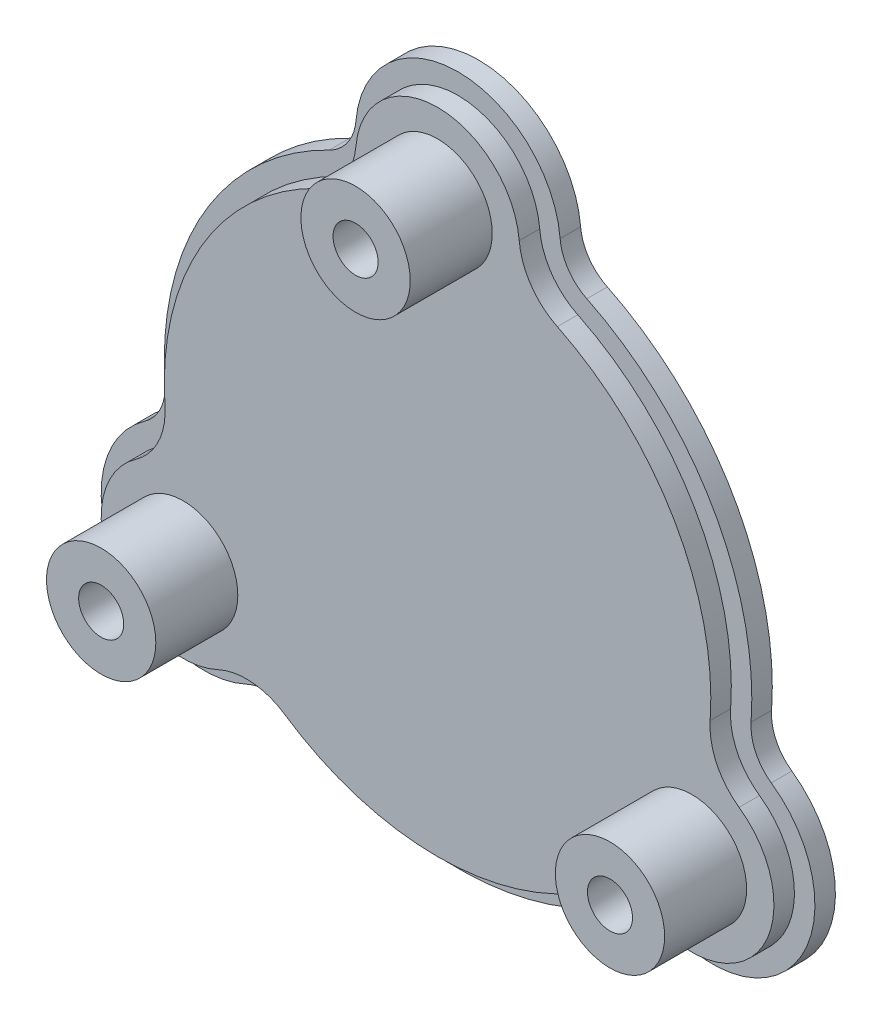
ISO-10303-21;
HEADER;
FILE_DESCRIPTION(('STEP AP214'),'2;1');
FILE_NAME('part.step','',(''),(''),'','','');
FILE_SCHEMA(('AUTOMOTIVE_DESIGN { 1 0 10303 214 1 1 1 1 }'));
ENDSEC;
DATA;
#1=APPLICATION_CONTEXT('core data for automotive mechanical design processes');
#2=APPLICATION_PROTOCOL_DEFINITION('international standard','automotive_design',2000,#1);
#3=PRODUCT_CONTEXT('',#1,'mechanical');
#4=PRODUCT('Part','Part','',(#3));
#5=PRODUCT_RELATED_PRODUCT_CATEGORY('part','',(#4));
#6=PRODUCT_DEFINITION_FORMATION('','',#4);
#7=PRODUCT_DEFINITION_CONTEXT('part definition',#1,'design');
#8=PRODUCT_DEFINITION('design','',#6,#7);
#9=PRODUCT_DEFINITION_SHAPE('','',#8);
#10=(LENGTH_UNIT() NAMED_UNIT(*) SI_UNIT(.MILLI.,.METRE.));
#11=(NAMED_UNIT(*) PLANE_ANGLE_UNIT() SI_UNIT($,.RADIAN.));
#12=(NAMED_UNIT(*) SI_UNIT($,.STERADIAN.) SOLID_ANGLE_UNIT());
#13=UNCERTAINTY_MEASURE_WITH_UNIT(LENGTH_MEASURE(1.E-05),#10,'distance_accuracy_value','');
#14=(GEOMETRIC_REPRESENTATION_CONTEXT(3) GLOBAL_UNCERTAINTY_ASSIGNED_CONTEXT((#13)) GLOBAL_UNIT_ASSIGNED_CONTEXT((#10,
#11,#12)) REPRESENTATION_CONTEXT('',''));
#15=CARTESIAN_POINT('',(0.,0.,0.));
#16=DIRECTION('',(0.,0.,1.));
#17=DIRECTION('',(1.,0.,0.));
#18=AXIS2_PLACEMENT_3D('',#15,#16,#17);
#19=CARTESIAN_POINT('',(49.8778588175734,-3.49273528544797,3.));
#20=DIRECTION('',(0.,0.,-1.));
#21=DIRECTION('',(-1.,0.,0.));
#22=AXIS2_PLACEMENT_3D('',#19,#20,#21);
#23=CYLINDRICAL_SURFACE('',#22,7.);
#24=CARTESIAN_POINT('',(49.8778588175734,-3.49273528544797,0.));
#25=DIRECTION('',(0.,0.,1.));
#26=DIRECTION('',(1.,0.,0.));
#27=AXIS2_PLACEMENT_3D('',#24,#25,#26);
#28=CIRCLE('',#27,7.);
#29=CARTESIAN_POINT('',(42.8949585831132,-3.00375234548526,0.));
#30=VERTEX_POINT('',#29);
#31=CARTESIAN_POINT('',(45.8564331273962,-9.22231951280553,0.));
#32=VERTEX_POINT('',#31);
#33=EDGE_CURVE('E243',#30,#32,#28,.T.);
#34=ORIENTED_EDGE('',*,*,#33,.F.);
#35=DIRECTION('',(0.,0.,-1.));
#36=VECTOR('',#35,1.);
#37=CARTESIAN_POINT('',(42.8949585831132,-3.00375234548526,3.));
#38=LINE('',#37,#36);
#39=CARTESIAN_POINT('',(42.8949585831132,-3.00375234548526,3.));
#40=VERTEX_POINT('',#39);
#41=EDGE_CURVE('E11',#40,#30,#38,.T.);
#42=ORIENTED_EDGE('',*,*,#41,.F.);
#43=CARTESIAN_POINT('',(49.8778588175734,-3.49273528544797,3.));
#44=DIRECTION('',(0.,0.,1.));
#45=DIRECTION('',(1.,0.,0.));
#46=AXIS2_PLACEMENT_3D('',#43,#44,#45);
#47=CIRCLE('',#46,7.);
#48=CARTESIAN_POINT('',(45.8564331273962,-9.22231951280553,3.));
#49=VERTEX_POINT('',#48);
#50=EDGE_CURVE('E310',#40,#49,#47,.T.);
#51=ORIENTED_EDGE('',*,*,#50,.T.);
#52=DIRECTION('',(0.,0.,-1.));
#53=VECTOR('',#52,1.);
#54=CARTESIAN_POINT('',(45.8564331273962,-9.22231951280553,3.));
#55=LINE('',#54,#53);
#56=EDGE_CURVE('E103',#49,#32,#55,.T.);
#57=ORIENTED_EDGE('',*,*,#56,.T.);
#58=EDGE_LOOP('',(#34,#42,#51,#57));
#59=FACE_BOUND('',#58,.T.);
#60=ADVANCED_FACE('F39',(#59),#23,.F.);
#61=CARTESIAN_POINT('',(0.,0.,3.));
#62=DIRECTION('',(0.,0.,-1.));
#63=DIRECTION('',(-1.,0.,0.));
#64=AXIS2_PLACEMENT_3D('',#61,#62,#63);
#65=CYLINDRICAL_SURFACE('',#64,43.);
#66=CARTESIAN_POINT('',(0.,0.,0.));
#67=DIRECTION('',(0.,0.,1.));
#68=DIRECTION('',(1.,0.,0.));
#69=AXIS2_PLACEMENT_3D('',#66,#67,#68);
#70=CIRCLE('',#69,43.);
#71=CARTESIAN_POINT('',(18.8461534536892,38.65,0.));
#72=VERTEX_POINT('',#71);
#73=EDGE_CURVE('E240',#30,#72,#70,.T.);
#74=ORIENTED_EDGE('',*,*,#73,.T.);
#75=DIRECTION('',(0.,0.,-1.));
#76=VECTOR('',#75,1.);
#77=CARTESIAN_POINT('',(18.8461534536892,38.65,3.));
#78=LINE('',#77,#76);
#79=CARTESIAN_POINT('',(18.8461534536892,38.65,3.));
#80=VERTEX_POINT('',#79);
#81=EDGE_CURVE('E48',#80,#72,#78,.T.);
#82=ORIENTED_EDGE('',*,*,#81,.F.);
#83=CARTESIAN_POINT('',(0.,0.,3.));
#84=DIRECTION('',(0.,0.,1.));
#85=DIRECTION('',(1.,0.,0.));
#86=AXIS2_PLACEMENT_3D('',#83,#84,#85);
#87=CIRCLE('',#86,43.);
#88=EDGE_CURVE('E307',#40,#80,#87,.T.);
#89=ORIENTED_EDGE('',*,*,#88,.F.);
#90=ORIENTED_EDGE('',*,*,#41,.T.);
#91=EDGE_LOOP('',(#74,#82,#89,#90));
#92=FACE_BOUND('',#91,.T.);
#93=ADVANCED_FACE('F241',(#92),#65,.T.);
#94=CARTESIAN_POINT('',(21.9141319228944,44.9418604651163,3.));
#95=DIRECTION('',(0.,0.,-1.));
#96=DIRECTION('',(-1.,0.,0.));
#97=AXIS2_PLACEMENT_3D('',#94,#95,#96);
#98=CYLINDRICAL_SURFACE('',#97,7.);
#99=CARTESIAN_POINT('',(21.9141319228944,44.9418604651163,0.));
#100=DIRECTION('',(0.,0.,1.));
#101=DIRECTION('',(1.,0.,0.));
#102=AXIS2_PLACEMENT_3D('',#99,#100,#101);
#103=CIRCLE('',#102,7.);
#104=CARTESIAN_POINT('',(14.9414535837918,44.3239957716702,0.));
#105=VERTEX_POINT('',#104);
#106=EDGE_CURVE('E233',#72,#105,#103,.F.);
#107=ORIENTED_EDGE('',*,*,#106,.T.);
#108=DIRECTION('',(0.,0.,-1.));
#109=VECTOR('',#108,1.);
#110=CARTESIAN_POINT('',(14.9414535837918,44.3239957716702,3.));
#111=LINE('',#110,#109);
#112=CARTESIAN_POINT('',(14.9414535837918,44.3239957716702,3.));
#113=VERTEX_POINT('',#112);
#114=EDGE_CURVE('E222',#113,#105,#111,.T.);
#115=ORIENTED_EDGE('',*,*,#114,.F.);
#116=CARTESIAN_POINT('',(21.9141319228944,44.9418604651163,3.));
#117=DIRECTION('',(0.,0.,1.));
#118=DIRECTION('',(1.,0.,0.));
#119=AXIS2_PLACEMENT_3D('',#116,#117,#118);
#120=CIRCLE('',#119,7.);
#121=EDGE_CURVE('E235',#80,#113,#120,.F.);
#122=ORIENTED_EDGE('',*,*,#121,.F.);
#123=ORIENTED_EDGE('',*,*,#81,.T.);
#124=EDGE_LOOP('',(#107,#115,#122,#123));
#125=FACE_BOUND('',#124,.T.);
#126=ADVANCED_FACE('F231',(#125),#98,.F.);
#127=CARTESIAN_POINT('',(0.,43.,3.));
#128=DIRECTION('',(0.,0.,-1.));
#129=DIRECTION('',(-1.,0.,0.));
#130=AXIS2_PLACEMENT_3D('',#127,#128,#129);
#131=CYLINDRICAL_SURFACE('',#130,15.0000000000002);
#132=CARTESIAN_POINT('',(0.,43.,0.));
#133=DIRECTION('',(0.,0.,1.));
#134=DIRECTION('',(1.,0.,0.));
#135=AXIS2_PLACEMENT_3D('',#132,#133,#134);
#136=CIRCLE('',#135,15.0000000000002);
#137=CARTESIAN_POINT('',(-14.9414535837918,44.3239957716701,0.));
#138=VERTEX_POINT('',#137);
#139=EDGE_CURVE('E247',#105,#138,#136,.T.);
#140=ORIENTED_EDGE('',*,*,#139,.T.);
#141=DIRECTION('',(0.,0.,-1.));
#142=VECTOR('',#141,1.);
#143=CARTESIAN_POINT('',(-14.9414535837918,44.3239957716701,3.));
#144=LINE('',#143,#142);
#145=CARTESIAN_POINT('',(-14.9414535837918,44.3239957716701,3.));
#146=VERTEX_POINT('',#145);
#147=EDGE_CURVE('E219',#146,#138,#144,.T.);
#148=ORIENTED_EDGE('',*,*,#147,.F.);
#149=CARTESIAN_POINT('',(0.,43.,3.));
#150=DIRECTION('',(0.,0.,1.));
#151=DIRECTION('',(1.,0.,0.));
#152=AXIS2_PLACEMENT_3D('',#149,#150,#151);
#153=CIRCLE('',#152,15.0000000000002);
#154=EDGE_CURVE('E302',#113,#146,#153,.T.);
#155=ORIENTED_EDGE('',*,*,#154,.F.);
#156=ORIENTED_EDGE('',*,*,#114,.T.);
#157=EDGE_LOOP('',(#140,#148,#155,#156));
#158=FACE_BOUND('',#157,.T.);
#159=ADVANCED_FACE('F637',(#158),#131,.T.);
#160=CARTESIAN_POINT('',(-21.9141319228947,44.9418604651161,3.));
#161=DIRECTION('',(0.,0.,-1.));
#162=DIRECTION('',(-1.,0.,0.));
#163=AXIS2_PLACEMENT_3D('',#160,#161,#162);
#164=CYLINDRICAL_SURFACE('',#163,7.);
#165=CARTESIAN_POINT('',(-21.9141319228947,44.9418604651161,0.));
#166=DIRECTION('',(0.,0.,1.));
#167=DIRECTION('',(1.,0.,0.));
#168=AXIS2_PLACEMENT_3D('',#165,#166,#167);
#169=CIRCLE('',#168,7.);
#170=CARTESIAN_POINT('',(-18.8461534536894,38.6499999999999,0.));
#171=VERTEX_POINT('',#170);
#172=EDGE_CURVE('E256',#171,#138,#169,.T.);
#173=ORIENTED_EDGE('',*,*,#172,.F.);
#174=DIRECTION('',(0.,0.,-1.));
#175=VECTOR('',#174,1.);
#176=CARTESIAN_POINT('',(-18.8461534536894,38.6499999999999,3.));
#177=LINE('',#176,#175);
#178=CARTESIAN_POINT('',(-18.8461534536894,38.6499999999999,3.));
#179=VERTEX_POINT('',#178);
#180=EDGE_CURVE('E216',#179,#171,#177,.T.);
#181=ORIENTED_EDGE('',*,*,#180,.F.);
#182=CARTESIAN_POINT('',(-21.9141319228947,44.9418604651161,3.));
#183=DIRECTION('',(0.,0.,1.));
#184=DIRECTION('',(1.,0.,0.));
#185=AXIS2_PLACEMENT_3D('',#182,#183,#184);
#186=CIRCLE('',#185,7.);
#187=EDGE_CURVE('E298',#179,#146,#186,.T.);
#188=ORIENTED_EDGE('',*,*,#187,.T.);
#189=ORIENTED_EDGE('',*,*,#147,.T.);
#190=EDGE_LOOP('',(#173,#181,#188,#189));
#191=FACE_BOUND('',#190,.T.);
#192=ADVANCED_FACE('F633',(#191),#164,.F.);
#193=CARTESIAN_POINT('',(0.,0.,3.));
#194=DIRECTION('',(0.,0.,-1.));
#195=DIRECTION('',(-1.,0.,0.));
#196=AXIS2_PLACEMENT_3D('',#193,#194,#195);
#197=CYLINDRICAL_SURFACE('',#196,43.);
#198=CARTESIAN_POINT('',(0.,0.,0.));
#199=DIRECTION('',(0.,0.,1.));
#200=DIRECTION('',(1.,0.,0.));
#201=AXIS2_PLACEMENT_3D('',#198,#199,#200);
#202=CIRCLE('',#201,43.);
#203=CARTESIAN_POINT('',(-42.8949585831132,-3.00375234548494,0.));
#204=VERTEX_POINT('',#203);
#205=EDGE_CURVE('E260',#171,#204,#202,.T.);
#206=ORIENTED_EDGE('',*,*,#205,.T.);
#207=DIRECTION('',(0.,0.,-1.));
#208=VECTOR('',#207,1.);
#209=CARTESIAN_POINT('',(-42.8949585831132,-3.00375234548494,3.));
#210=LINE('',#209,#208);
#211=CARTESIAN_POINT('',(-42.8949585831132,-3.00375234548494,3.));
#212=VERTEX_POINT('',#211);
#213=EDGE_CURVE('E212',#212,#204,#210,.T.);
#214=ORIENTED_EDGE('',*,*,#213,.F.);
#215=CARTESIAN_POINT('',(0.,0.,3.));
#216=DIRECTION('',(0.,0.,1.));
#217=DIRECTION('',(1.,0.,0.));
#218=AXIS2_PLACEMENT_3D('',#215,#216,#217);
#219=CIRCLE('',#218,43.);
#220=EDGE_CURVE('E294',#179,#212,#219,.T.);
#221=ORIENTED_EDGE('',*,*,#220,.F.);
#222=ORIENTED_EDGE('',*,*,#180,.T.);
#223=EDGE_LOOP('',(#206,#214,#221,#222));
#224=FACE_BOUND('',#223,.T.);
#225=ADVANCED_FACE('F629',(#224),#197,.T.);
#226=CARTESIAN_POINT('',(-49.8778588175735,-3.49273528544762,3.));
#227=DIRECTION('',(0.,0.,-1.));
#228=DIRECTION('',(-1.,0.,0.));
#229=AXIS2_PLACEMENT_3D('',#226,#227,#228);
#230=CYLINDRICAL_SURFACE('',#229,7.);
#231=CARTESIAN_POINT('',(-49.8778588175735,-3.49273528544762,0.));
#232=DIRECTION('',(0.,0.,1.));
#233=DIRECTION('',(1.,0.,0.));
#234=AXIS2_PLACEMENT_3D('',#231,#232,#233);
#235=CIRCLE('',#234,7.);
#236=CARTESIAN_POINT('',(-45.8564331273964,-9.22231951280496,0.));
#237=VERTEX_POINT('',#236);
#238=EDGE_CURVE('E264',#204,#237,#235,.F.);
#239=ORIENTED_EDGE('',*,*,#238,.T.);
#240=DIRECTION('',(0.,0.,-1.));
#241=VECTOR('',#240,1.);
#242=CARTESIAN_POINT('',(-45.8564331273964,-9.22231951280496,3.));
#243=LINE('',#242,#241);
#244=CARTESIAN_POINT('',(-45.8564331273964,-9.22231951280496,3.));
#245=VERTEX_POINT('',#244);
#246=EDGE_CURVE('E208',#245,#237,#243,.T.);
#247=ORIENTED_EDGE('',*,*,#246,.F.);
#248=CARTESIAN_POINT('',(-49.8778588175735,-3.49273528544762,3.));
#249=DIRECTION('',(0.,0.,1.));
#250=DIRECTION('',(1.,0.,0.));
#251=AXIS2_PLACEMENT_3D('',#248,#249,#250);
#252=CIRCLE('',#251,7.);
#253=EDGE_CURVE('E290',#212,#245,#252,.F.);
#254=ORIENTED_EDGE('',*,*,#253,.F.);
#255=ORIENTED_EDGE('',*,*,#213,.T.);
#256=EDGE_LOOP('',(#239,#247,#254,#255));
#257=FACE_BOUND('',#256,.T.);
#258=ADVANCED_FACE('F625',(#257),#230,.F.);
#259=CARTESIAN_POINT('',(-37.2390923627311,-21.4999999999997,3.));
#260=DIRECTION('',(0.,0.,-1.));
#261=DIRECTION('',(-1.,0.,0.));
#262=AXIS2_PLACEMENT_3D('',#259,#260,#261);
#263=CYLINDRICAL_SURFACE('',#262,15.0000000000002);
#264=CARTESIAN_POINT('',(-37.2390923627311,-21.4999999999997,0.));
#265=DIRECTION('',(0.,0.,1.));
#266=DIRECTION('',(1.,0.,0.));
#267=AXIS2_PLACEMENT_3D('',#264,#265,#266);
#268=CIRCLE('',#267,15.0000000000002);
#269=CARTESIAN_POINT('',(-30.9149795436048,-35.1016762588645,0.));
#270=VERTEX_POINT('',#269);
#271=EDGE_CURVE('E268',#237,#270,#268,.T.);
#272=ORIENTED_EDGE('',*,*,#271,.T.);
#273=DIRECTION('',(0.,0.,-1.));
#274=VECTOR('',#273,1.);
#275=CARTESIAN_POINT('',(-30.9149795436048,-35.1016762588645,3.));
#276=LINE('',#275,#274);
#277=CARTESIAN_POINT('',(-30.9149795436048,-35.1016762588645,3.));
#278=VERTEX_POINT('',#277);
#279=EDGE_CURVE('E201',#278,#270,#276,.T.);
#280=ORIENTED_EDGE('',*,*,#279,.F.);
#281=CARTESIAN_POINT('',(-37.2390923627311,-21.4999999999997,3.));
#282=DIRECTION('',(0.,0.,1.));
#283=DIRECTION('',(1.,0.,0.));
#284=AXIS2_PLACEMENT_3D('',#281,#282,#283);
#285=CIRCLE('',#284,15.0000000000002);
#286=EDGE_CURVE('E287',#245,#278,#285,.T.);
#287=ORIENTED_EDGE('',*,*,#286,.F.);
#288=ORIENTED_EDGE('',*,*,#246,.T.);
#289=EDGE_LOOP('',(#272,#280,#287,#288));
#290=FACE_BOUND('',#289,.T.);
#291=ADVANCED_FACE('F621',(#290),#263,.T.);
#292=CARTESIAN_POINT('',(-27.9637268946791,-41.4491251796681,3.));
#293=DIRECTION('',(0.,0.,-1.));
#294=DIRECTION('',(-1.,0.,0.));
#295=AXIS2_PLACEMENT_3D('',#292,#293,#294);
#296=CYLINDRICAL_SURFACE('',#295,6.99999999999999);
#297=CARTESIAN_POINT('',(-27.9637268946791,-41.4491251796681,0.));
#298=DIRECTION('',(0.,0.,1.));
#299=DIRECTION('',(1.,0.,0.));
#300=AXIS2_PLACEMENT_3D('',#297,#298,#299);
#301=CIRCLE('',#300,6.99999999999999);
#302=CARTESIAN_POINT('',(-24.0488051294241,-35.6462476545146,0.));
#303=VERTEX_POINT('',#302);
#304=EDGE_CURVE('E272',#303,#270,#301,.T.);
#305=ORIENTED_EDGE('',*,*,#304,.F.);
#306=DIRECTION('',(0.,0.,-1.));
#307=VECTOR('',#306,1.);
#308=CARTESIAN_POINT('',(-24.0488051294241,-35.6462476545146,3.));
#309=LINE('',#308,#307);
#310=CARTESIAN_POINT('',(-24.0488051294241,-35.6462476545146,3.));
#311=VERTEX_POINT('',#310);
#312=EDGE_CURVE('E197',#311,#303,#309,.T.);
#313=ORIENTED_EDGE('',*,*,#312,.F.);
#314=CARTESIAN_POINT('',(-27.9637268946791,-41.4491251796681,3.));
#315=DIRECTION('',(0.,0.,1.));
#316=DIRECTION('',(1.,0.,0.));
#317=AXIS2_PLACEMENT_3D('',#314,#315,#316);
#318=CIRCLE('',#317,6.99999999999999);
#319=EDGE_CURVE('E189',#311,#278,#318,.T.);
#320=ORIENTED_EDGE('',*,*,#319,.T.);
#321=ORIENTED_EDGE('',*,*,#279,.T.);
#322=EDGE_LOOP('',(#305,#313,#320,#321));
#323=FACE_BOUND('',#322,.T.);
#324=ADVANCED_FACE('F618',(#323),#296,.F.);
#325=CARTESIAN_POINT('',(0.,0.,3.));
#326=DIRECTION('',(0.,0.,-1.));
#327=DIRECTION('',(-1.,0.,0.));
#328=AXIS2_PLACEMENT_3D('',#325,#326,#327);
#329=CYLINDRICAL_SURFACE('',#328,43.);
#330=CARTESIAN_POINT('',(0.,0.,0.));
#331=DIRECTION('',(0.,0.,1.));
#332=DIRECTION('',(1.,0.,0.));
#333=AXIS2_PLACEMENT_3D('',#330,#331,#332);
#334=CIRCLE('',#333,43.);
#335=CARTESIAN_POINT('',(24.0488051294238,-35.6462476545148,0.));
#336=VERTEX_POINT('',#335);
#337=EDGE_CURVE('E195',#303,#336,#334,.T.);
#338=ORIENTED_EDGE('',*,*,#337,.T.);
#339=DIRECTION('',(0.,0.,-1.));
#340=VECTOR('',#339,1.);
#341=CARTESIAN_POINT('',(24.0488051294238,-35.6462476545148,3.));
#342=LINE('',#341,#340);
#343=CARTESIAN_POINT('',(24.0488051294238,-35.6462476545148,3.));
#344=VERTEX_POINT('',#343);
#345=EDGE_CURVE('E179',#344,#336,#342,.T.);
#346=ORIENTED_EDGE('',*,*,#345,.F.);
#347=CARTESIAN_POINT('',(0.,0.,3.));
#348=DIRECTION('',(0.,0.,1.));
#349=DIRECTION('',(1.,0.,0.));
#350=AXIS2_PLACEMENT_3D('',#347,#348,#349);
#351=CIRCLE('',#350,43.);
#352=EDGE_CURVE('E183',#311,#344,#351,.T.);
#353=ORIENTED_EDGE('',*,*,#352,.F.);
#354=ORIENTED_EDGE('',*,*,#312,.T.);
#355=EDGE_LOOP('',(#338,#346,#353,#354));
#356=FACE_BOUND('',#355,.T.);
#357=ADVANCED_FACE('F193',(#356),#329,.T.);
#358=CARTESIAN_POINT('',(27.9637268946789,-41.4491251796683,3.));
#359=DIRECTION('',(0.,0.,-1.));
#360=DIRECTION('',(-1.,0.,0.));
#361=AXIS2_PLACEMENT_3D('',#358,#359,#360);
#362=CYLINDRICAL_SURFACE('',#361,7.00000000000001);
#363=CARTESIAN_POINT('',(27.9637268946789,-41.4491251796683,0.));
#364=DIRECTION('',(0.,0.,1.));
#365=DIRECTION('',(1.,0.,0.));
#366=AXIS2_PLACEMENT_3D('',#363,#364,#365);
#367=CIRCLE('',#366,7.00000000000001);
#368=CARTESIAN_POINT('',(30.9149795436044,-35.101676258865,0.));
#369=VERTEX_POINT('',#368);
#370=EDGE_CURVE('E278',#336,#369,#367,.F.);
#371=ORIENTED_EDGE('',*,*,#370,.T.);
#372=DIRECTION('',(0.,0.,-1.));
#373=VECTOR('',#372,1.);
#374=CARTESIAN_POINT('',(30.9149795436044,-35.101676258865,3.));
#375=LINE('',#374,#373);
#376=CARTESIAN_POINT('',(30.9149795436044,-35.101676258865,3.));
#377=VERTEX_POINT('',#376);
#378=EDGE_CURVE('E181',#377,#369,#375,.T.);
#379=ORIENTED_EDGE('',*,*,#378,.F.);
#380=CARTESIAN_POINT('',(27.9637268946789,-41.4491251796683,3.));
#381=DIRECTION('',(0.,0.,1.));
#382=DIRECTION('',(1.,0.,0.));
#383=AXIS2_PLACEMENT_3D('',#380,#381,#382);
#384=CIRCLE('',#383,7.00000000000001);
#385=EDGE_CURVE('E174',#344,#377,#384,.F.);
#386=ORIENTED_EDGE('',*,*,#385,.F.);
#387=ORIENTED_EDGE('',*,*,#345,.T.);
#388=EDGE_LOOP('',(#371,#379,#386,#387));
#389=FACE_BOUND('',#388,.T.);
#390=ADVANCED_FACE('F177',(#389),#362,.F.);
#391=CARTESIAN_POINT('',(37.2390923627308,-21.5000000000002,3.));
#392=DIRECTION('',(0.,0.,-1.));
#393=DIRECTION('',(-1.,0.,0.));
#394=AXIS2_PLACEMENT_3D('',#391,#392,#393);
#395=CYLINDRICAL_SURFACE('',#394,15.0000000000002);
#396=CARTESIAN_POINT('',(37.2390923627308,-21.5000000000002,0.));
#397=DIRECTION('',(0.,0.,1.));
#398=DIRECTION('',(1.,0.,0.));
#399=AXIS2_PLACEMENT_3D('',#396,#397,#398);
#400=CIRCLE('',#399,15.0000000000002);
#401=EDGE_CURVE('E96',#369,#32,#400,.T.);
#402=ORIENTED_EDGE('',*,*,#401,.T.);
#403=ORIENTED_EDGE('',*,*,#56,.F.);
#404=CARTESIAN_POINT('',(37.2390923627308,-21.5000000000002,3.));
#405=DIRECTION('',(0.,0.,1.));
#406=DIRECTION('',(1.,0.,0.));
#407=AXIS2_PLACEMENT_3D('',#404,#405,#406);
#408=CIRCLE('',#407,15.0000000000002);
#409=EDGE_CURVE('E56',#377,#49,#408,.T.);
#410=ORIENTED_EDGE('',*,*,#409,.F.);
#411=ORIENTED_EDGE('',*,*,#378,.T.);
#412=EDGE_LOOP('',(#402,#403,#410,#411));
#413=FACE_BOUND('',#412,.T.);
#414=ADVANCED_FACE('F609',(#413),#395,.T.);
#415=CARTESIAN_POINT('',(0.,0.,3.));
#416=DIRECTION('',(0.,0.,1.));
#417=DIRECTION('',(1.,0.,0.));
#418=AXIS2_PLACEMENT_3D('',#415,#416,#417);
#419=PLANE('',#418);
#420=CARTESIAN_POINT('',(0.,0.,3.));
#421=DIRECTION('',(0.,0.,1.));
#422=DIRECTION('',(1.,0.,0.));
#423=AXIS2_PLACEMENT_3D('',#420,#421,#422);
#424=CIRCLE('',#423,40.);
#425=CARTESIAN_POINT('',(39.9022870540587,-2.79418822835838,3.));
#426=VERTEX_POINT('',#425);
#427=CARTESIAN_POINT('',(17.5313055383155,35.953488372093,3.));
#428=VERTEX_POINT('',#427);
#429=EDGE_CURVE('E111',#426,#428,#424,.T.);
#430=ORIENTED_EDGE('',*,*,#429,.F.);
#431=CARTESIAN_POINT('',(49.8778588175734,-3.49273528544797,3.));
#432=DIRECTION('',(0.,0.,1.));
#433=DIRECTION('',(1.,0.,0.));
#434=AXIS2_PLACEMENT_3D('',#431,#432,#433);
#435=CIRCLE('',#434,10.0000000000001);
#436=CARTESIAN_POINT('',(44.1329649744632,-11.6778556102444,3.));
#437=VERTEX_POINT('',#436);
#438=EDGE_CURVE('E351',#426,#437,#435,.T.);
#439=ORIENTED_EDGE('',*,*,#438,.T.);
#440=CARTESIAN_POINT('',(37.2390923627308,-21.5000000000002,3.));
#441=DIRECTION('',(0.,0.,1.));
#442=DIRECTION('',(1.,0.,0.));
#443=AXIS2_PLACEMENT_3D('',#440,#441,#442);
#444=CIRCLE('',#443,12.0000000000001);
#445=CARTESIAN_POINT('',(32.1798021074297,-32.381341007092,3.));
#446=VERTEX_POINT('',#445);
#447=EDGE_CURVE('E347',#446,#437,#444,.T.);
#448=ORIENTED_EDGE('',*,*,#447,.F.);
#449=CARTESIAN_POINT('',(27.9637268946789,-41.4491251796683,3.));
#450=DIRECTION('',(0.,0.,1.));
#451=DIRECTION('',(1.,0.,0.));
#452=AXIS2_PLACEMENT_3D('',#449,#450,#451);
#453=CIRCLE('',#452,10.);
#454=CARTESIAN_POINT('',(22.3709815157431,-33.1593001437347,3.));
#455=VERTEX_POINT('',#454);
#456=EDGE_CURVE('E343',#455,#446,#453,.F.);
#457=ORIENTED_EDGE('',*,*,#456,.F.);
#458=CARTESIAN_POINT('',(0.,0.,3.));
#459=DIRECTION('',(0.,0.,1.));
#460=DIRECTION('',(1.,0.,0.));
#461=AXIS2_PLACEMENT_3D('',#458,#459,#460);
#462=CIRCLE('',#461,40.);
#463=CARTESIAN_POINT('',(-22.3709815157433,-33.1593001437344,3.));
#464=VERTEX_POINT('',#463);
#465=EDGE_CURVE('E339',#464,#455,#462,.T.);
#466=ORIENTED_EDGE('',*,*,#465,.F.);
#467=CARTESIAN_POINT('',(-27.9637268946791,-41.4491251796681,3.));
#468=DIRECTION('',(0.,0.,1.));
#469=DIRECTION('',(1.,0.,0.));
#470=AXIS2_PLACEMENT_3D('',#467,#468,#469);
#471=CIRCLE('',#470,10.0000000000001);
#472=CARTESIAN_POINT('',(-32.17980210743,-32.3813410070916,3.));
#473=VERTEX_POINT('',#472);
#474=EDGE_CURVE('E336',#464,#473,#471,.T.);
#475=ORIENTED_EDGE('',*,*,#474,.T.);
#476=CARTESIAN_POINT('',(-37.2390923627311,-21.4999999999997,3.));
#477=DIRECTION('',(0.,0.,1.));
#478=DIRECTION('',(1.,0.,0.));
#479=AXIS2_PLACEMENT_3D('',#476,#477,#478);
#480=CIRCLE('',#479,12.0000000000001);
#481=CARTESIAN_POINT('',(-44.1329649744633,-11.6778556102439,3.));
#482=VERTEX_POINT('',#481);
#483=EDGE_CURVE('E332',#482,#473,#480,.T.);
#484=ORIENTED_EDGE('',*,*,#483,.F.);
#485=CARTESIAN_POINT('',(-49.8778588175735,-3.49273528544762,3.));
#486=DIRECTION('',(0.,0.,1.));
#487=DIRECTION('',(1.,0.,0.));
#488=AXIS2_PLACEMENT_3D('',#485,#486,#487);
#489=CIRCLE('',#488,10.);
#490=CARTESIAN_POINT('',(-39.9022870540588,-2.79418822835809,3.));
#491=VERTEX_POINT('',#490);
#492=EDGE_CURVE('E328',#491,#482,#489,.F.);
#493=ORIENTED_EDGE('',*,*,#492,.F.);
#494=CARTESIAN_POINT('',(0.,0.,3.));
#495=DIRECTION('',(0.,0.,1.));
#496=DIRECTION('',(1.,0.,0.));
#497=AXIS2_PLACEMENT_3D('',#494,#495,#496);
#498=CIRCLE('',#497,40.);
#499=CARTESIAN_POINT('',(-17.5313055383157,35.9534883720929,3.));
#500=VERTEX_POINT('',#499);
#501=EDGE_CURVE('E324',#500,#491,#498,.T.);
#502=ORIENTED_EDGE('',*,*,#501,.F.);
#503=CARTESIAN_POINT('',(-21.9141319228947,44.9418604651161,3.));
#504=DIRECTION('',(0.,0.,1.));
#505=DIRECTION('',(1.,0.,0.));
#506=AXIS2_PLACEMENT_3D('',#503,#504,#505);
#507=CIRCLE('',#506,10.0000000000001);
#508=CARTESIAN_POINT('',(-11.9531628670334,44.0591966173361,3.));
#509=VERTEX_POINT('',#508);
#510=EDGE_CURVE('E321',#500,#509,#507,.T.);
#511=ORIENTED_EDGE('',*,*,#510,.T.);
#512=CARTESIAN_POINT('',(0.,43.,3.));
#513=DIRECTION('',(0.,0.,1.));
#514=DIRECTION('',(1.,0.,0.));
#515=AXIS2_PLACEMENT_3D('',#512,#513,#514);
#516=CIRCLE('',#515,12.0000000000001);
#517=CARTESIAN_POINT('',(11.9531628670333,44.0591966173362,3.));
#518=VERTEX_POINT('',#517);
#519=EDGE_CURVE('E317',#518,#509,#516,.T.);
#520=ORIENTED_EDGE('',*,*,#519,.F.);
#521=CARTESIAN_POINT('',(21.9141319228944,44.9418604651163,3.));
#522=DIRECTION('',(0.,0.,1.));
#523=DIRECTION('',(1.,0.,0.));
#524=AXIS2_PLACEMENT_3D('',#521,#522,#523);
#525=CIRCLE('',#524,10.);
#526=EDGE_CURVE('E313',#428,#518,#525,.F.);
#527=ORIENTED_EDGE('',*,*,#526,.F.);
#528=EDGE_LOOP('',(#430,#439,#448,#457,#466,#475,#484,#493,#502,#511,#520,#527));
#529=FACE_BOUND('',#528,.T.);
#530=ORIENTED_EDGE('',*,*,#50,.F.);
#531=ORIENTED_EDGE('',*,*,#88,.T.);
#532=ORIENTED_EDGE('',*,*,#121,.T.);
#533=ORIENTED_EDGE('',*,*,#154,.T.);
#534=ORIENTED_EDGE('',*,*,#187,.F.);
#535=ORIENTED_EDGE('',*,*,#220,.T.);
#536=ORIENTED_EDGE('',*,*,#253,.T.);
#537=ORIENTED_EDGE('',*,*,#286,.T.);
#538=ORIENTED_EDGE('',*,*,#319,.F.);
#539=ORIENTED_EDGE('',*,*,#352,.T.);
#540=ORIENTED_EDGE('',*,*,#385,.T.);
#541=ORIENTED_EDGE('',*,*,#409,.T.);
#542=EDGE_LOOP('',(#530,#531,#532,#533,#534,#535,#536,#537,#538,#539,#540,#541));
#543=FACE_BOUND('',#542,.T.);
#544=ADVANCED_FACE('F187',(#529,#543),#419,.T.);
#545=CARTESIAN_POINT('',(0.,0.,0.));
#546=DIRECTION('',(0.,0.,1.));
#547=DIRECTION('',(1.,0.,0.));
#548=AXIS2_PLACEMENT_3D('',#545,#546,#547);
#549=PLANE('',#548);
#550=ORIENTED_EDGE('',*,*,#33,.T.);
#551=ORIENTED_EDGE('',*,*,#401,.F.);
#552=ORIENTED_EDGE('',*,*,#370,.F.);
#553=ORIENTED_EDGE('',*,*,#337,.F.);
#554=ORIENTED_EDGE('',*,*,#304,.T.);
#555=ORIENTED_EDGE('',*,*,#271,.F.);
#556=ORIENTED_EDGE('',*,*,#238,.F.);
#557=ORIENTED_EDGE('',*,*,#205,.F.);
#558=ORIENTED_EDGE('',*,*,#172,.T.);
#559=ORIENTED_EDGE('',*,*,#139,.F.);
#560=ORIENTED_EDGE('',*,*,#106,.F.);
#561=ORIENTED_EDGE('',*,*,#73,.F.);
#562=EDGE_LOOP('',(#550,#551,#552,#553,#554,#555,#556,#557,#558,#559,#560,#561));
#563=FACE_BOUND('',#562,.T.);
#564=CARTESIAN_POINT('',(37.2390923627308,-21.5000000000002,0.));
#565=DIRECTION('',(0.,0.,1.));
#566=DIRECTION('',(1.,0.,0.));
#567=AXIS2_PLACEMENT_3D('',#564,#565,#566);
#568=CIRCLE('',#567,3.3);
#569=CARTESIAN_POINT('',(40.5390923627308,-21.5000000000002,0.));
#570=VERTEX_POINT('',#569);
#571=EDGE_CURVE('E464',#570,#570,#568,.T.);
#572=ORIENTED_EDGE('',*,*,#571,.T.);
#573=EDGE_LOOP('',(#572));
#574=FACE_BOUND('',#573,.T.);
#575=CARTESIAN_POINT('',(-37.2390923627311,-21.4999999999997,0.));
#576=DIRECTION('',(0.,0.,1.));
#577=DIRECTION('',(1.,0.,0.));
#578=AXIS2_PLACEMENT_3D('',#575,#576,#577);
#579=CIRCLE('',#578,3.3);
#580=CARTESIAN_POINT('',(-33.9390923627311,-21.4999999999997,0.));
#581=VERTEX_POINT('',#580);
#582=EDGE_CURVE('E476',#581,#581,#579,.T.);
#583=ORIENTED_EDGE('',*,*,#582,.T.);
#584=EDGE_LOOP('',(#583));
#585=FACE_BOUND('',#584,.T.);
#586=CARTESIAN_POINT('',(0.,43.,0.));
#587=DIRECTION('',(0.,0.,1.));
#588=DIRECTION('',(1.,0.,0.));
#589=AXIS2_PLACEMENT_3D('',#586,#587,#588);
#590=CIRCLE('',#589,3.3);
#591=CARTESIAN_POINT('',(3.3,43.,0.));
#592=VERTEX_POINT('',#591);
#593=EDGE_CURVE('E488',#592,#592,#590,.T.);
#594=ORIENTED_EDGE('',*,*,#593,.T.);
#595=EDGE_LOOP('',(#594));
#596=FACE_BOUND('',#595,.T.);
#597=ADVANCED_FACE('F522',(#563,#574,#585,#596),#549,.F.);
#598=CARTESIAN_POINT('',(49.8778588175734,-3.49273528544797,6.));
#599=DIRECTION('',(0.,0.,-1.));
#600=DIRECTION('',(-1.,0.,0.));
#601=AXIS2_PLACEMENT_3D('',#598,#599,#600);
#602=CYLINDRICAL_SURFACE('',#601,10.0000000000001);
#603=DIRECTION('',(0.,0.,-1.));
#604=VECTOR('',#603,1.);
#605=CARTESIAN_POINT('',(44.1329649744632,-11.6778556102444,6.));
#606=LINE('',#605,#604);
#607=CARTESIAN_POINT('',(44.1329649744632,-11.6778556102444,6.));
#608=VERTEX_POINT('',#607);
#609=EDGE_CURVE('E399',#608,#437,#606,.T.);
#610=ORIENTED_EDGE('',*,*,#609,.T.);
#611=ORIENTED_EDGE('',*,*,#438,.F.);
#612=DIRECTION('',(0.,0.,-1.));
#613=VECTOR('',#612,1.);
#614=CARTESIAN_POINT('',(39.9022870540587,-2.79418822835838,6.));
#615=LINE('',#614,#613);
#616=CARTESIAN_POINT('',(39.9022870540587,-2.79418822835838,6.));
#617=VERTEX_POINT('',#616);
#618=EDGE_CURVE('E249',#617,#426,#615,.T.);
#619=ORIENTED_EDGE('',*,*,#618,.F.);
#620=CARTESIAN_POINT('',(49.8778588175734,-3.49273528544797,6.));
#621=DIRECTION('',(0.,0.,1.));
#622=DIRECTION('',(1.,0.,0.));
#623=AXIS2_PLACEMENT_3D('',#620,#621,#622);
#624=CIRCLE('',#623,10.0000000000001);
#625=EDGE_CURVE('E447',#617,#608,#624,.T.);
#626=ORIENTED_EDGE('',*,*,#625,.T.);
#627=EDGE_LOOP('',(#610,#611,#619,#626));
#628=FACE_BOUND('',#627,.T.);
#629=ADVANCED_FACE('F525',(#628),#602,.F.);
#630=CARTESIAN_POINT('',(0.,0.,6.));
#631=DIRECTION('',(0.,0.,-1.));
#632=DIRECTION('',(-1.,0.,0.));
#633=AXIS2_PLACEMENT_3D('',#630,#631,#632);
#634=CYLINDRICAL_SURFACE('',#633,40.);
#635=ORIENTED_EDGE('',*,*,#429,.T.);
#636=DIRECTION('',(0.,0.,-1.));
#637=VECTOR('',#636,1.);
#638=CARTESIAN_POINT('',(17.5313055383155,35.953488372093,6.));
#639=LINE('',#638,#637);
#640=CARTESIAN_POINT('',(17.5313055383155,35.953488372093,6.));
#641=VERTEX_POINT('',#640);
#642=EDGE_CURVE('E359',#641,#428,#639,.T.);
#643=ORIENTED_EDGE('',*,*,#642,.F.);
#644=CARTESIAN_POINT('',(0.,0.,6.));
#645=DIRECTION('',(0.,0.,1.));
#646=DIRECTION('',(1.,0.,0.));
#647=AXIS2_PLACEMENT_3D('',#644,#645,#646);
#648=CIRCLE('',#647,40.);
#649=EDGE_CURVE('E443',#617,#641,#648,.T.);
#650=ORIENTED_EDGE('',*,*,#649,.F.);
#651=ORIENTED_EDGE('',*,*,#618,.T.);
#652=EDGE_LOOP('',(#635,#643,#650,#651));
#653=FACE_BOUND('',#652,.T.);
#654=ADVANCED_FACE('F600',(#653),#634,.T.);
#655=CARTESIAN_POINT('',(21.9141319228944,44.9418604651163,6.));
#656=DIRECTION('',(0.,0.,-1.));
#657=DIRECTION('',(-1.,0.,0.));
#658=AXIS2_PLACEMENT_3D('',#655,#656,#657);
#659=CYLINDRICAL_SURFACE('',#658,10.);
#660=ORIENTED_EDGE('',*,*,#526,.T.);
#661=DIRECTION('',(0.,0.,-1.));
#662=VECTOR('',#661,1.);
#663=CARTESIAN_POINT('',(11.9531628670333,44.0591966173362,6.));
#664=LINE('',#663,#662);
#665=CARTESIAN_POINT('',(11.9531628670333,44.0591966173362,6.));
#666=VERTEX_POINT('',#665);
#667=EDGE_CURVE('E363',#666,#518,#664,.T.);
#668=ORIENTED_EDGE('',*,*,#667,.F.);
#669=CARTESIAN_POINT('',(21.9141319228944,44.9418604651163,6.));
#670=DIRECTION('',(0.,0.,1.));
#671=DIRECTION('',(1.,0.,0.));
#672=AXIS2_PLACEMENT_3D('',#669,#670,#671);
#673=CIRCLE('',#672,10.);
#674=EDGE_CURVE('E439',#641,#666,#673,.F.);
#675=ORIENTED_EDGE('',*,*,#674,.F.);
#676=ORIENTED_EDGE('',*,*,#642,.T.);
#677=EDGE_LOOP('',(#660,#668,#675,#676));
#678=FACE_BOUND('',#677,.T.);
#679=ADVANCED_FACE('F596',(#678),#659,.F.);
#680=CARTESIAN_POINT('',(0.,43.,6.));
#681=DIRECTION('',(0.,0.,-1.));
#682=DIRECTION('',(-1.,0.,0.));
#683=AXIS2_PLACEMENT_3D('',#680,#681,#682);
#684=CYLINDRICAL_SURFACE('',#683,12.0000000000001);
#685=ORIENTED_EDGE('',*,*,#519,.T.);
#686=DIRECTION('',(0.,0.,-1.));
#687=VECTOR('',#686,1.);
#688=CARTESIAN_POINT('',(-11.9531628670334,44.0591966173361,6.));
#689=LINE('',#688,#687);
#690=CARTESIAN_POINT('',(-11.9531628670334,44.0591966173361,6.));
#691=VERTEX_POINT('',#690);
#692=EDGE_CURVE('E367',#691,#509,#689,.T.);
#693=ORIENTED_EDGE('',*,*,#692,.F.);
#694=CARTESIAN_POINT('',(0.,43.,6.));
#695=DIRECTION('',(0.,0.,1.));
#696=DIRECTION('',(1.,0.,0.));
#697=AXIS2_PLACEMENT_3D('',#694,#695,#696);
#698=CIRCLE('',#697,12.0000000000001);
#699=EDGE_CURVE('E435',#666,#691,#698,.T.);
#700=ORIENTED_EDGE('',*,*,#699,.F.);
#701=ORIENTED_EDGE('',*,*,#667,.T.);
#702=EDGE_LOOP('',(#685,#693,#700,#701));
#703=FACE_BOUND('',#702,.T.);
#704=ADVANCED_FACE('F592',(#703),#684,.T.);
#705=CARTESIAN_POINT('',(-21.9141319228947,44.9418604651161,6.));
#706=DIRECTION('',(0.,0.,-1.));
#707=DIRECTION('',(-1.,0.,0.));
#708=AXIS2_PLACEMENT_3D('',#705,#706,#707);
#709=CYLINDRICAL_SURFACE('',#708,10.0000000000001);
#710=ORIENTED_EDGE('',*,*,#692,.T.);
#711=ORIENTED_EDGE('',*,*,#510,.F.);
#712=DIRECTION('',(0.,0.,-1.));
#713=VECTOR('',#712,1.);
#714=CARTESIAN_POINT('',(-17.5313055383157,35.9534883720929,6.));
#715=LINE('',#714,#713);
#716=CARTESIAN_POINT('',(-17.5313055383157,35.9534883720929,6.));
#717=VERTEX_POINT('',#716);
#718=EDGE_CURVE('E371',#717,#500,#715,.T.);
#719=ORIENTED_EDGE('',*,*,#718,.F.);
#720=CARTESIAN_POINT('',(-21.9141319228947,44.9418604651161,6.));
#721=DIRECTION('',(0.,0.,1.));
#722=DIRECTION('',(1.,0.,0.));
#723=AXIS2_PLACEMENT_3D('',#720,#721,#722);
#724=CIRCLE('',#723,10.0000000000001);
#725=EDGE_CURVE('E431',#717,#691,#724,.T.);
#726=ORIENTED_EDGE('',*,*,#725,.T.);
#727=EDGE_LOOP('',(#710,#711,#719,#726));
#728=FACE_BOUND('',#727,.T.);
#729=ADVANCED_FACE('F588',(#728),#709,.F.);
#730=CARTESIAN_POINT('',(0.,0.,6.));
#731=DIRECTION('',(0.,0.,-1.));
#732=DIRECTION('',(-1.,0.,0.));
#733=AXIS2_PLACEMENT_3D('',#730,#731,#732);
#734=CYLINDRICAL_SURFACE('',#733,40.);
#735=ORIENTED_EDGE('',*,*,#501,.T.);
#736=DIRECTION('',(0.,0.,-1.));
#737=VECTOR('',#736,1.);
#738=CARTESIAN_POINT('',(-39.9022870540588,-2.79418822835809,6.));
#739=LINE('',#738,#737);
#740=CARTESIAN_POINT('',(-39.9022870540588,-2.79418822835809,6.));
#741=VERTEX_POINT('',#740);
#742=EDGE_CURVE('E375',#741,#491,#739,.T.);
#743=ORIENTED_EDGE('',*,*,#742,.F.);
#744=CARTESIAN_POINT('',(0.,0.,6.));
#745=DIRECTION('',(0.,0.,1.));
#746=DIRECTION('',(1.,0.,0.));
#747=AXIS2_PLACEMENT_3D('',#744,#745,#746);
#748=CIRCLE('',#747,40.);
#749=EDGE_CURVE('E427',#717,#741,#748,.T.);
#750=ORIENTED_EDGE('',*,*,#749,.F.);
#751=ORIENTED_EDGE('',*,*,#718,.T.);
#752=EDGE_LOOP('',(#735,#743,#750,#751));
#753=FACE_BOUND('',#752,.T.);
#754=ADVANCED_FACE('F584',(#753),#734,.T.);
#755=CARTESIAN_POINT('',(-49.8778588175735,-3.49273528544762,6.));
#756=DIRECTION('',(0.,0.,-1.));
#757=DIRECTION('',(-1.,0.,0.));
#758=AXIS2_PLACEMENT_3D('',#755,#756,#757);
#759=CYLINDRICAL_SURFACE('',#758,10.);
#760=ORIENTED_EDGE('',*,*,#492,.T.);
#761=DIRECTION('',(0.,0.,-1.));
#762=VECTOR('',#761,1.);
#763=CARTESIAN_POINT('',(-44.1329649744633,-11.6778556102439,6.));
#764=LINE('',#763,#762);
#765=CARTESIAN_POINT('',(-44.1329649744633,-11.6778556102439,6.));
#766=VERTEX_POINT('',#765);
#767=EDGE_CURVE('E379',#766,#482,#764,.T.);
#768=ORIENTED_EDGE('',*,*,#767,.F.);
#769=CARTESIAN_POINT('',(-49.8778588175735,-3.49273528544762,6.));
#770=DIRECTION('',(0.,0.,1.));
#771=DIRECTION('',(1.,0.,0.));
#772=AXIS2_PLACEMENT_3D('',#769,#770,#771);
#773=CIRCLE('',#772,10.);
#774=EDGE_CURVE('E423',#741,#766,#773,.F.);
#775=ORIENTED_EDGE('',*,*,#774,.F.);
#776=ORIENTED_EDGE('',*,*,#742,.T.);
#777=EDGE_LOOP('',(#760,#768,#775,#776));
#778=FACE_BOUND('',#777,.T.);
#779=ADVANCED_FACE('F580',(#778),#759,.F.);
#780=CARTESIAN_POINT('',(-37.2390923627311,-21.4999999999997,6.));
#781=DIRECTION('',(0.,0.,-1.));
#782=DIRECTION('',(-1.,0.,0.));
#783=AXIS2_PLACEMENT_3D('',#780,#781,#782);
#784=CYLINDRICAL_SURFACE('',#783,12.0000000000001);
#785=ORIENTED_EDGE('',*,*,#483,.T.);
#786=DIRECTION('',(0.,0.,-1.));
#787=VECTOR('',#786,1.);
#788=CARTESIAN_POINT('',(-32.17980210743,-32.3813410070916,6.));
#789=LINE('',#788,#787);
#790=CARTESIAN_POINT('',(-32.17980210743,-32.3813410070916,6.));
#791=VERTEX_POINT('',#790);
#792=EDGE_CURVE('E383',#791,#473,#789,.T.);
#793=ORIENTED_EDGE('',*,*,#792,.F.);
#794=CARTESIAN_POINT('',(-37.2390923627311,-21.4999999999997,6.));
#795=DIRECTION('',(0.,0.,1.));
#796=DIRECTION('',(1.,0.,0.));
#797=AXIS2_PLACEMENT_3D('',#794,#795,#796);
#798=CIRCLE('',#797,12.0000000000001);
#799=EDGE_CURVE('E419',#766,#791,#798,.T.);
#800=ORIENTED_EDGE('',*,*,#799,.F.);
#801=ORIENTED_EDGE('',*,*,#767,.T.);
#802=EDGE_LOOP('',(#785,#793,#800,#801));
#803=FACE_BOUND('',#802,.T.);
#804=ADVANCED_FACE('F576',(#803),#784,.T.);
#805=CARTESIAN_POINT('',(-27.9637268946791,-41.4491251796681,6.));
#806=DIRECTION('',(0.,0.,-1.));
#807=DIRECTION('',(-1.,0.,0.));
#808=AXIS2_PLACEMENT_3D('',#805,#806,#807);
#809=CYLINDRICAL_SURFACE('',#808,10.0000000000001);
#810=ORIENTED_EDGE('',*,*,#792,.T.);
#811=ORIENTED_EDGE('',*,*,#474,.F.);
#812=DIRECTION('',(0.,0.,-1.));
#813=VECTOR('',#812,1.);
#814=CARTESIAN_POINT('',(-22.3709815157433,-33.1593001437344,6.));
#815=LINE('',#814,#813);
#816=CARTESIAN_POINT('',(-22.3709815157433,-33.1593001437344,6.));
#817=VERTEX_POINT('',#816);
#818=EDGE_CURVE('E387',#817,#464,#815,.T.);
#819=ORIENTED_EDGE('',*,*,#818,.F.);
#820=CARTESIAN_POINT('',(-27.9637268946791,-41.4491251796681,6.));
#821=DIRECTION('',(0.,0.,1.));
#822=DIRECTION('',(1.,0.,0.));
#823=AXIS2_PLACEMENT_3D('',#820,#821,#822);
#824=CIRCLE('',#823,10.0000000000001);
#825=EDGE_CURVE('E415',#817,#791,#824,.T.);
#826=ORIENTED_EDGE('',*,*,#825,.T.);
#827=EDGE_LOOP('',(#810,#811,#819,#826));
#828=FACE_BOUND('',#827,.T.);
#829=ADVANCED_FACE('F572',(#828),#809,.F.);
#830=CARTESIAN_POINT('',(0.,0.,6.));
#831=DIRECTION('',(0.,0.,-1.));
#832=DIRECTION('',(-1.,0.,0.));
#833=AXIS2_PLACEMENT_3D('',#830,#831,#832);
#834=CYLINDRICAL_SURFACE('',#833,40.);
#835=ORIENTED_EDGE('',*,*,#465,.T.);
#836=DIRECTION('',(0.,0.,-1.));
#837=VECTOR('',#836,1.);
#838=CARTESIAN_POINT('',(22.3709815157431,-33.1593001437347,6.));
#839=LINE('',#838,#837);
#840=CARTESIAN_POINT('',(22.3709815157431,-33.1593001437347,6.));
#841=VERTEX_POINT('',#840);
#842=EDGE_CURVE('E391',#841,#455,#839,.T.);
#843=ORIENTED_EDGE('',*,*,#842,.F.);
#844=CARTESIAN_POINT('',(0.,0.,6.));
#845=DIRECTION('',(0.,0.,1.));
#846=DIRECTION('',(1.,0.,0.));
#847=AXIS2_PLACEMENT_3D('',#844,#845,#846);
#848=CIRCLE('',#847,40.);
#849=EDGE_CURVE('E411',#817,#841,#848,.T.);
#850=ORIENTED_EDGE('',*,*,#849,.F.);
#851=ORIENTED_EDGE('',*,*,#818,.T.);
#852=EDGE_LOOP('',(#835,#843,#850,#851));
#853=FACE_BOUND('',#852,.T.);
#854=ADVANCED_FACE('F568',(#853),#834,.T.);
#855=CARTESIAN_POINT('',(27.9637268946789,-41.4491251796683,6.));
#856=DIRECTION('',(0.,0.,-1.));
#857=DIRECTION('',(-1.,0.,0.));
#858=AXIS2_PLACEMENT_3D('',#855,#856,#857);
#859=CYLINDRICAL_SURFACE('',#858,10.);
#860=ORIENTED_EDGE('',*,*,#456,.T.);
#861=DIRECTION('',(0.,0.,-1.));
#862=VECTOR('',#861,1.);
#863=CARTESIAN_POINT('',(32.1798021074297,-32.381341007092,6.));
#864=LINE('',#863,#862);
#865=CARTESIAN_POINT('',(32.1798021074297,-32.381341007092,6.));
#866=VERTEX_POINT('',#865);
#867=EDGE_CURVE('E395',#866,#446,#864,.T.);
#868=ORIENTED_EDGE('',*,*,#867,.F.);
#869=CARTESIAN_POINT('',(27.9637268946789,-41.4491251796683,6.));
#870=DIRECTION('',(0.,0.,1.));
#871=DIRECTION('',(1.,0.,0.));
#872=AXIS2_PLACEMENT_3D('',#869,#870,#871);
#873=CIRCLE('',#872,10.);
#874=EDGE_CURVE('E407',#841,#866,#873,.F.);
#875=ORIENTED_EDGE('',*,*,#874,.F.);
#876=ORIENTED_EDGE('',*,*,#842,.T.);
#877=EDGE_LOOP('',(#860,#868,#875,#876));
#878=FACE_BOUND('',#877,.T.);
#879=ADVANCED_FACE('F564',(#878),#859,.F.);
#880=CARTESIAN_POINT('',(37.2390923627308,-21.5000000000002,6.));
#881=DIRECTION('',(0.,0.,-1.));
#882=DIRECTION('',(-1.,0.,0.));
#883=AXIS2_PLACEMENT_3D('',#880,#881,#882);
#884=CYLINDRICAL_SURFACE('',#883,12.0000000000001);
#885=ORIENTED_EDGE('',*,*,#447,.T.);
#886=ORIENTED_EDGE('',*,*,#609,.F.);
#887=CARTESIAN_POINT('',(37.2390923627308,-21.5000000000002,6.));
#888=DIRECTION('',(0.,0.,1.));
#889=DIRECTION('',(1.,0.,0.));
#890=AXIS2_PLACEMENT_3D('',#887,#888,#889);
#891=CIRCLE('',#890,12.0000000000001);
#892=EDGE_CURVE('E403',#866,#608,#891,.T.);
#893=ORIENTED_EDGE('',*,*,#892,.F.);
#894=ORIENTED_EDGE('',*,*,#867,.T.);
#895=EDGE_LOOP('',(#885,#886,#893,#894));
#896=FACE_BOUND('',#895,.T.);
#897=ADVANCED_FACE('F560',(#896),#884,.T.);
#898=CARTESIAN_POINT('',(0.,0.,6.));
#899=DIRECTION('',(0.,0.,1.));
#900=DIRECTION('',(1.,0.,0.));
#901=AXIS2_PLACEMENT_3D('',#898,#899,#900);
#902=PLANE('',#901);
#903=CARTESIAN_POINT('',(-37.2390923627311,-21.4999999999997,6.));
#904=DIRECTION('',(0.,0.,1.));
#905=DIRECTION('',(1.,0.,0.));
#906=AXIS2_PLACEMENT_3D('',#903,#904,#905);
#907=CIRCLE('',#906,8.);
#908=CARTESIAN_POINT('',(-29.2390923627311,-21.4999999999997,6.));
#909=VERTEX_POINT('',#908);
#910=EDGE_CURVE('E459',#909,#909,#907,.T.);
#911=ORIENTED_EDGE('',*,*,#910,.F.);
#912=EDGE_LOOP('',(#911));
#913=FACE_BOUND('',#912,.T.);
#914=CARTESIAN_POINT('',(37.2390923627308,-21.5000000000002,6.));
#915=DIRECTION('',(0.,0.,1.));
#916=DIRECTION('',(1.,0.,0.));
#917=AXIS2_PLACEMENT_3D('',#914,#915,#916);
#918=CIRCLE('',#917,8.);
#919=CARTESIAN_POINT('',(45.2390923627308,-21.5000000000002,6.));
#920=VERTEX_POINT('',#919);
#921=EDGE_CURVE('E455',#920,#920,#918,.T.);
#922=ORIENTED_EDGE('',*,*,#921,.F.);
#923=EDGE_LOOP('',(#922));
#924=FACE_BOUND('',#923,.T.);
#925=CARTESIAN_POINT('',(0.,43.,6.));
#926=DIRECTION('',(0.,0.,1.));
#927=DIRECTION('',(1.,0.,0.));
#928=AXIS2_PLACEMENT_3D('',#925,#926,#927);
#929=CIRCLE('',#928,8.);
#930=CARTESIAN_POINT('',(8.,43.,6.));
#931=VERTEX_POINT('',#930);
#932=EDGE_CURVE('E451',#931,#931,#929,.T.);
#933=ORIENTED_EDGE('',*,*,#932,.F.);
#934=EDGE_LOOP('',(#933));
#935=FACE_BOUND('',#934,.T.);
#936=ORIENTED_EDGE('',*,*,#625,.F.);
#937=ORIENTED_EDGE('',*,*,#649,.T.);
#938=ORIENTED_EDGE('',*,*,#674,.T.);
#939=ORIENTED_EDGE('',*,*,#699,.T.);
#940=ORIENTED_EDGE('',*,*,#725,.F.);
#941=ORIENTED_EDGE('',*,*,#749,.T.);
#942=ORIENTED_EDGE('',*,*,#774,.T.);
#943=ORIENTED_EDGE('',*,*,#799,.T.);
#944=ORIENTED_EDGE('',*,*,#825,.F.);
#945=ORIENTED_EDGE('',*,*,#849,.T.);
#946=ORIENTED_EDGE('',*,*,#874,.T.);
#947=ORIENTED_EDGE('',*,*,#892,.T.);
#948=EDGE_LOOP('',(#936,#937,#938,#939,#940,#941,#942,#943,#944,#945,#946,#947));
#949=FACE_BOUND('',#948,.T.);
#950=ADVANCED_FACE('F556',(#913,#924,#935,#949),#902,.T.);
#951=CARTESIAN_POINT('',(37.2390923627308,-21.5000000000002,18.));
#952=DIRECTION('',(0.,0.,-1.));
#953=DIRECTION('',(-1.,0.,0.));
#954=AXIS2_PLACEMENT_3D('',#951,#952,#953);
#955=CYLINDRICAL_SURFACE('',#954,3.3);
#956=CARTESIAN_POINT('',(37.2390923627308,-21.5000000000002,18.));
#957=DIRECTION('',(0.,0.,1.));
#958=DIRECTION('',(1.,0.,0.));
#959=AXIS2_PLACEMENT_3D('',#956,#957,#958);
#960=CIRCLE('',#959,3.3);
#961=CARTESIAN_POINT('',(40.5390923627308,-21.5000000000002,18.));
#962=VERTEX_POINT('',#961);
#963=EDGE_CURVE('E468',#962,#962,#960,.T.);
#964=ORIENTED_EDGE('',*,*,#963,.T.);
#965=EDGE_LOOP('',(#964));
#966=FACE_BOUND('',#965,.T.);
#967=ORIENTED_EDGE('',*,*,#571,.F.);
#968=EDGE_LOOP('',(#967));
#969=FACE_BOUND('',#968,.T.);
#970=ADVANCED_FACE('F552',(#966,#969),#955,.F.);
#971=CARTESIAN_POINT('',(37.2390923627308,-21.5000000000002,18.));
#972=DIRECTION('',(0.,0.,-1.));
#973=DIRECTION('',(-1.,0.,0.));
#974=AXIS2_PLACEMENT_3D('',#971,#972,#973);
#975=CYLINDRICAL_SURFACE('',#974,8.);
#976=ORIENTED_EDGE('',*,*,#921,.T.);
#977=EDGE_LOOP('',(#976));
#978=FACE_BOUND('',#977,.T.);
#979=CARTESIAN_POINT('',(37.2390923627308,-21.5000000000002,18.));
#980=DIRECTION('',(0.,0.,1.));
#981=DIRECTION('',(1.,0.,0.));
#982=AXIS2_PLACEMENT_3D('',#979,#980,#981);
#983=CIRCLE('',#982,8.);
#984=CARTESIAN_POINT('',(45.2390923627308,-21.5000000000002,18.));
#985=VERTEX_POINT('',#984);
#986=EDGE_CURVE('E463',#985,#985,#983,.T.);
#987=ORIENTED_EDGE('',*,*,#986,.F.);
#988=EDGE_LOOP('',(#987));
#989=FACE_BOUND('',#988,.T.);
#990=ADVANCED_FACE('F545',(#978,#989),#975,.T.);
#991=CARTESIAN_POINT('',(0.,0.,18.));
#992=DIRECTION('',(0.,0.,1.));
#993=DIRECTION('',(1.,0.,0.));
#994=AXIS2_PLACEMENT_3D('',#991,#992,#993);
#995=PLANE('',#994);
#996=ORIENTED_EDGE('',*,*,#963,.F.);
#997=EDGE_LOOP('',(#996));
#998=FACE_BOUND('',#997,.T.);
#999=ORIENTED_EDGE('',*,*,#986,.T.);
#1000=EDGE_LOOP('',(#999));
#1001=FACE_BOUND('',#1000,.T.);
#1002=ADVANCED_FACE('F536',(#998,#1001),#995,.T.);
#1003=CARTESIAN_POINT('',(-37.2390923627311,-21.4999999999997,18.));
#1004=DIRECTION('',(0.,0.,-1.));
#1005=DIRECTION('',(-1.,0.,0.));
#1006=AXIS2_PLACEMENT_3D('',#1003,#1004,#1005);
#1007=CYLINDRICAL_SURFACE('',#1006,3.3);
#1008=CARTESIAN_POINT('',(-37.2390923627311,-21.4999999999997,18.));
#1009=DIRECTION('',(0.,0.,1.));
#1010=DIRECTION('',(1.,0.,0.));
#1011=AXIS2_PLACEMENT_3D('',#1008,#1009,#1010);
#1012=CIRCLE('',#1011,3.3);
#1013=CARTESIAN_POINT('',(-33.9390923627311,-21.4999999999997,18.));
#1014=VERTEX_POINT('',#1013);
#1015=EDGE_CURVE('E480',#1014,#1014,#1012,.T.);
#1016=ORIENTED_EDGE('',*,*,#1015,.T.);
#1017=EDGE_LOOP('',(#1016));
#1018=FACE_BOUND('',#1017,.T.);
#1019=ORIENTED_EDGE('',*,*,#582,.F.);
#1020=EDGE_LOOP('',(#1019));
#1021=FACE_BOUND('',#1020,.T.);
#1022=ADVANCED_FACE('F533',(#1018,#1021),#1007,.F.);
#1023=CARTESIAN_POINT('',(-37.2390923627311,-21.4999999999997,18.));
#1024=DIRECTION('',(0.,0.,-1.));
#1025=DIRECTION('',(-1.,0.,0.));
#1026=AXIS2_PLACEMENT_3D('',#1023,#1024,#1025);
#1027=CYLINDRICAL_SURFACE('',#1026,8.);
#1028=ORIENTED_EDGE('',*,*,#910,.T.);
#1029=EDGE_LOOP('',(#1028));
#1030=FACE_BOUND('',#1029,.T.);
#1031=CARTESIAN_POINT('',(-37.2390923627311,-21.4999999999997,18.));
#1032=DIRECTION('',(0.,0.,1.));
#1033=DIRECTION('',(1.,0.,0.));
#1034=AXIS2_PLACEMENT_3D('',#1031,#1032,#1033);
#1035=CIRCLE('',#1034,8.);
#1036=CARTESIAN_POINT('',(-29.2390923627311,-21.4999999999997,18.));
#1037=VERTEX_POINT('',#1036);
#1038=EDGE_CURVE('E469',#1037,#1037,#1035,.T.);
#1039=ORIENTED_EDGE('',*,*,#1038,.F.);
#1040=EDGE_LOOP('',(#1039));
#1041=FACE_BOUND('',#1040,.T.);
#1042=ADVANCED_FACE('F535',(#1030,#1041),#1027,.T.);
#1043=CARTESIAN_POINT('',(0.,0.,18.));
#1044=DIRECTION('',(0.,0.,1.));
#1045=DIRECTION('',(1.,0.,0.));
#1046=AXIS2_PLACEMENT_3D('',#1043,#1044,#1045);
#1047=PLANE('',#1046);
#1048=ORIENTED_EDGE('',*,*,#1015,.F.);
#1049=EDGE_LOOP('',(#1048));
#1050=FACE_BOUND('',#1049,.T.);
#1051=ORIENTED_EDGE('',*,*,#1038,.T.);
#1052=EDGE_LOOP('',(#1051));
#1053=FACE_BOUND('',#1052,.T.);
#1054=ADVANCED_FACE('F516',(#1050,#1053),#1047,.T.);
#1055=CARTESIAN_POINT('',(0.,43.,18.));
#1056=DIRECTION('',(0.,0.,-1.));
#1057=DIRECTION('',(-1.,0.,0.));
#1058=AXIS2_PLACEMENT_3D('',#1055,#1056,#1057);
#1059=CYLINDRICAL_SURFACE('',#1058,3.3);
#1060=CARTESIAN_POINT('',(0.,43.,18.));
#1061=DIRECTION('',(0.,0.,1.));
#1062=DIRECTION('',(1.,0.,0.));
#1063=AXIS2_PLACEMENT_3D('',#1060,#1061,#1062);
#1064=CIRCLE('',#1063,3.3);
#1065=CARTESIAN_POINT('',(3.3,43.,18.));
#1066=VERTEX_POINT('',#1065);
#1067=EDGE_CURVE('E492',#1066,#1066,#1064,.T.);
#1068=ORIENTED_EDGE('',*,*,#1067,.T.);
#1069=EDGE_LOOP('',(#1068));
#1070=FACE_BOUND('',#1069,.T.);
#1071=ORIENTED_EDGE('',*,*,#593,.F.);
#1072=EDGE_LOOP('',(#1071));
#1073=FACE_BOUND('',#1072,.T.);
#1074=ADVANCED_FACE('F500',(#1070,#1073),#1059,.F.);
#1075=CARTESIAN_POINT('',(0.,43.,18.));
#1076=DIRECTION('',(0.,0.,-1.));
#1077=DIRECTION('',(-1.,0.,0.));
#1078=AXIS2_PLACEMENT_3D('',#1075,#1076,#1077);
#1079=CYLINDRICAL_SURFACE('',#1078,8.);
#1080=ORIENTED_EDGE('',*,*,#932,.T.);
#1081=EDGE_LOOP('',(#1080));
#1082=FACE_BOUND('',#1081,.T.);
#1083=CARTESIAN_POINT('',(0.,43.,18.));
#1084=DIRECTION('',(0.,0.,1.));
#1085=DIRECTION('',(1.,0.,0.));
#1086=AXIS2_PLACEMENT_3D('',#1083,#1084,#1085);
#1087=CIRCLE('',#1086,8.);
#1088=CARTESIAN_POINT('',(8.,43.,18.));
#1089=VERTEX_POINT('',#1088);
#1090=EDGE_CURVE('E481',#1089,#1089,#1087,.T.);
#1091=ORIENTED_EDGE('',*,*,#1090,.F.);
#1092=EDGE_LOOP('',(#1091));
#1093=FACE_BOUND('',#1092,.T.);
#1094=ADVANCED_FACE('F506',(#1082,#1093),#1079,.T.);
#1095=CARTESIAN_POINT('',(0.,0.,18.));
#1096=DIRECTION('',(0.,0.,1.));
#1097=DIRECTION('',(1.,0.,0.));
#1098=AXIS2_PLACEMENT_3D('',#1095,#1096,#1097);
#1099=PLANE('',#1098);
#1100=ORIENTED_EDGE('',*,*,#1067,.F.);
#1101=EDGE_LOOP('',(#1100));
#1102=FACE_BOUND('',#1101,.T.);
#1103=ORIENTED_EDGE('',*,*,#1090,.T.);
#1104=EDGE_LOOP('',(#1103));
#1105=FACE_BOUND('',#1104,.T.);
#1106=ADVANCED_FACE('F503',(#1102,#1105),#1099,.T.);
#1107=CLOSED_SHELL('',(#60,#93,#126,#159,#192,#225,#258,#291,#324,#357,#390,#414,#544,#597,#629,
#654,#679,#704,#729,#754,#779,#804,#829,#854,#879,#897,#950,#970,#990,#1002,#1022,#1042,#1054,
#1074,#1094,#1106));
#1108=MANIFOLD_SOLID_BREP('B2',#1107);
#1109=ADVANCED_BREP_SHAPE_REPRESENTATION('',(#18,#1108),#14);
#1110=SHAPE_DEFINITION_REPRESENTATION(#9,#1109);
ENDSEC;
END-ISO-10303-21;
